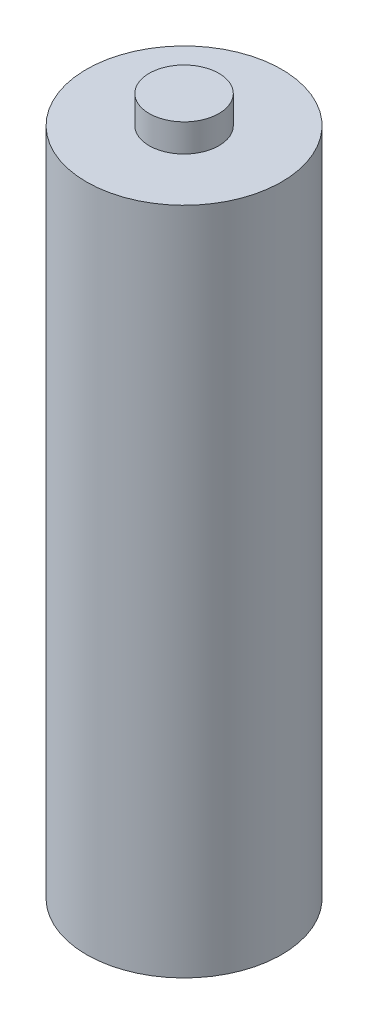
ISO-10303-21;
HEADER;
FILE_DESCRIPTION(('STEP AP214'),'2;1');
FILE_NAME('part.step','',(''),(''),'','','');
FILE_SCHEMA(('AUTOMOTIVE_DESIGN { 1 0 10303 214 1 1 1 1 }'));
ENDSEC;
DATA;
#1=APPLICATION_CONTEXT('core data for automotive mechanical design processes');
#2=APPLICATION_PROTOCOL_DEFINITION('international standard','automotive_design',2000,#1);
#3=PRODUCT_CONTEXT('',#1,'mechanical');
#4=PRODUCT('Part','Part','',(#3));
#5=PRODUCT_RELATED_PRODUCT_CATEGORY('part','',(#4));
#6=PRODUCT_DEFINITION_FORMATION('','',#4);
#7=PRODUCT_DEFINITION_CONTEXT('part definition',#1,'design');
#8=PRODUCT_DEFINITION('design','',#6,#7);
#9=PRODUCT_DEFINITION_SHAPE('','',#8);
#10=(LENGTH_UNIT() NAMED_UNIT(*) SI_UNIT(.MILLI.,.METRE.));
#11=(NAMED_UNIT(*) PLANE_ANGLE_UNIT() SI_UNIT($,.RADIAN.));
#12=(NAMED_UNIT(*) SI_UNIT($,.STERADIAN.) SOLID_ANGLE_UNIT());
#13=UNCERTAINTY_MEASURE_WITH_UNIT(LENGTH_MEASURE(1.E-05),#10,'distance_accuracy_value','');
#14=(GEOMETRIC_REPRESENTATION_CONTEXT(3) GLOBAL_UNCERTAINTY_ASSIGNED_CONTEXT((#13)) GLOBAL_UNIT_ASSIGNED_CONTEXT((#10,
#11,#12)) REPRESENTATION_CONTEXT('',''));
#15=CARTESIAN_POINT('',(0.,0.,0.));
#16=DIRECTION('',(0.,0.,1.));
#17=DIRECTION('',(1.,0.,0.));
#18=AXIS2_PLACEMENT_3D('',#15,#16,#17);
#19=CARTESIAN_POINT('',(0.,50.,0.));
#20=DIRECTION('',(0.,-1.,0.));
#21=DIRECTION('',(0.,0.,-1.));
#22=AXIS2_PLACEMENT_3D('',#19,#20,#21);
#23=CYLINDRICAL_SURFACE('',#22,2.5);
#24=CARTESIAN_POINT('',(0.,48.,0.));
#25=DIRECTION('',(0.,1.,0.));
#26=DIRECTION('',(0.,0.,1.));
#27=AXIS2_PLACEMENT_3D('',#24,#25,#26);
#28=CIRCLE('',#27,2.5);
#29=CARTESIAN_POINT('',(0.,48.,2.5));
#30=VERTEX_POINT('',#29);
#31=EDGE_CURVE('E37',#30,#30,#28,.T.);
#32=ORIENTED_EDGE('',*,*,#31,.T.);
#33=EDGE_LOOP('',(#32));
#34=FACE_BOUND('',#33,.T.);
#35=CARTESIAN_POINT('',(0.,50.,0.));
#36=DIRECTION('',(0.,1.,0.));
#37=DIRECTION('',(0.,0.,1.));
#38=AXIS2_PLACEMENT_3D('',#35,#36,#37);
#39=CIRCLE('',#38,2.5);
#40=CARTESIAN_POINT('',(0.,50.,2.5));
#41=VERTEX_POINT('',#40);
#42=EDGE_CURVE('E10',#41,#41,#39,.T.);
#43=ORIENTED_EDGE('',*,*,#42,.F.);
#44=EDGE_LOOP('',(#43));
#45=FACE_BOUND('',#44,.T.);
#46=ADVANCED_FACE('F34',(#34,#45),#23,.T.);
#47=CARTESIAN_POINT('',(0.,50.,0.));
#48=DIRECTION('',(0.,1.,0.));
#49=DIRECTION('',(0.,0.,1.));
#50=AXIS2_PLACEMENT_3D('',#47,#48,#49);
#51=PLANE('',#50);
#52=ORIENTED_EDGE('',*,*,#42,.T.);
#53=EDGE_LOOP('',(#52));
#54=FACE_BOUND('',#53,.T.);
#55=ADVANCED_FACE('F57',(#54),#51,.T.);
#56=CARTESIAN_POINT('',(0.,48.,0.));
#57=DIRECTION('',(0.,-1.,0.));
#58=DIRECTION('',(0.,0.,-1.));
#59=AXIS2_PLACEMENT_3D('',#56,#57,#58);
#60=CYLINDRICAL_SURFACE('',#59,7.);
#61=CARTESIAN_POINT('',(0.,48.,0.));
#62=DIRECTION('',(0.,1.,0.));
#63=DIRECTION('',(0.,0.,1.));
#64=AXIS2_PLACEMENT_3D('',#61,#62,#63);
#65=CIRCLE('',#64,7.);
#66=CARTESIAN_POINT('',(0.,48.,7.));
#67=VERTEX_POINT('',#66);
#68=EDGE_CURVE('E44',#67,#67,#65,.T.);
#69=ORIENTED_EDGE('',*,*,#68,.F.);
#70=EDGE_LOOP('',(#69));
#71=FACE_BOUND('',#70,.T.);
#72=CARTESIAN_POINT('',(0.,0.,0.));
#73=DIRECTION('',(0.,1.,0.));
#74=DIRECTION('',(0.,0.,1.));
#75=AXIS2_PLACEMENT_3D('',#72,#73,#74);
#76=CIRCLE('',#75,7.);
#77=CARTESIAN_POINT('',(0.,0.,7.));
#78=VERTEX_POINT('',#77);
#79=EDGE_CURVE('E46',#78,#78,#76,.T.);
#80=ORIENTED_EDGE('',*,*,#79,.T.);
#81=EDGE_LOOP('',(#80));
#82=FACE_BOUND('',#81,.T.);
#83=ADVANCED_FACE('F54',(#71,#82),#60,.T.);
#84=CARTESIAN_POINT('',(0.,48.,0.));
#85=DIRECTION('',(0.,1.,0.));
#86=DIRECTION('',(0.,0.,1.));
#87=AXIS2_PLACEMENT_3D('',#84,#85,#86);
#88=PLANE('',#87);
#89=ORIENTED_EDGE('',*,*,#31,.F.);
#90=EDGE_LOOP('',(#89));
#91=FACE_BOUND('',#90,.T.);
#92=ORIENTED_EDGE('',*,*,#68,.T.);
#93=EDGE_LOOP('',(#92));
#94=FACE_BOUND('',#93,.T.);
#95=ADVANCED_FACE('F52',(#91,#94),#88,.T.);
#96=CARTESIAN_POINT('',(0.,0.,0.));
#97=DIRECTION('',(0.,1.,0.));
#98=DIRECTION('',(0.,0.,1.));
#99=AXIS2_PLACEMENT_3D('',#96,#97,#98);
#100=PLANE('',#99);
#101=ORIENTED_EDGE('',*,*,#79,.F.);
#102=EDGE_LOOP('',(#101));
#103=FACE_BOUND('',#102,.T.);
#104=ADVANCED_FACE('F61',(#103),#100,.F.);
#105=CLOSED_SHELL('',(#46,#55,#83,#95,#104));
#106=MANIFOLD_SOLID_BREP('B2',#105);
#107=ADVANCED_BREP_SHAPE_REPRESENTATION('',(#18,#106),#14);
#108=SHAPE_DEFINITION_REPRESENTATION(#9,#107);
ENDSEC;
END-ISO-10303-21;
